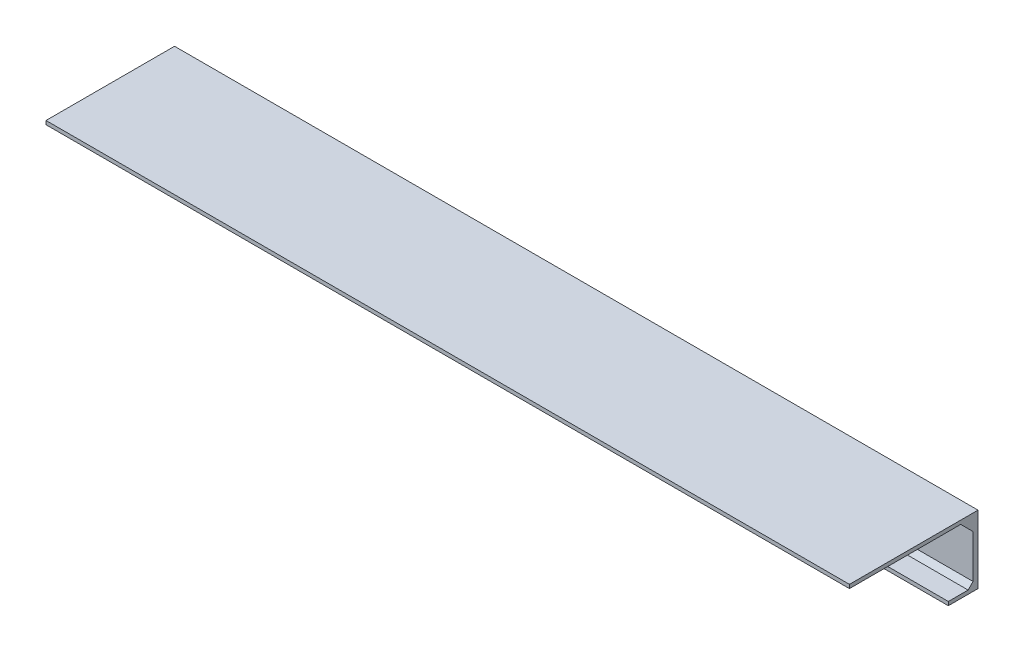
ISO-10303-21;
HEADER;
FILE_DESCRIPTION(('STEP AP214'),'2;1');
FILE_NAME('part.step','',(''),(''),'','','');
FILE_SCHEMA(('AUTOMOTIVE_DESIGN { 1 0 10303 214 1 1 1 1 }'));
ENDSEC;
DATA;
#1=APPLICATION_CONTEXT('core data for automotive mechanical design processes');
#2=APPLICATION_PROTOCOL_DEFINITION('international standard','automotive_design',2000,#1);
#3=PRODUCT_CONTEXT('',#1,'mechanical');
#4=PRODUCT('Part','Part','',(#3));
#5=PRODUCT_RELATED_PRODUCT_CATEGORY('part','',(#4));
#6=PRODUCT_DEFINITION_FORMATION('','',#4);
#7=PRODUCT_DEFINITION_CONTEXT('part definition',#1,'design');
#8=PRODUCT_DEFINITION('design','',#6,#7);
#9=PRODUCT_DEFINITION_SHAPE('','',#8);
#10=(LENGTH_UNIT() NAMED_UNIT(*) SI_UNIT(.MILLI.,.METRE.));
#11=(NAMED_UNIT(*) PLANE_ANGLE_UNIT() SI_UNIT($,.RADIAN.));
#12=(NAMED_UNIT(*) SI_UNIT($,.STERADIAN.) SOLID_ANGLE_UNIT());
#13=UNCERTAINTY_MEASURE_WITH_UNIT(LENGTH_MEASURE(1.E-05),#10,'distance_accuracy_value','');
#14=(GEOMETRIC_REPRESENTATION_CONTEXT(3) GLOBAL_UNCERTAINTY_ASSIGNED_CONTEXT((#13)) GLOBAL_UNIT_ASSIGNED_CONTEXT((#10,
#11,#12)) REPRESENTATION_CONTEXT('',''));
#15=CARTESIAN_POINT('',(0.,0.,0.));
#16=DIRECTION('',(0.,0.,1.));
#17=DIRECTION('',(1.,0.,0.));
#18=AXIS2_PLACEMENT_3D('',#15,#16,#17);
#19=CARTESIAN_POINT('',(0.,0.,0.8));
#20=DIRECTION('',(0.,0.,1.));
#21=DIRECTION('',(1.,0.,0.));
#22=AXIS2_PLACEMENT_3D('',#19,#20,#21);
#23=PLANE('',#22);
#24=DIRECTION('',(0.,-1.,0.));
#25=VECTOR('',#24,1.);
#26=CARTESIAN_POINT('',(-65.,-5.50000000000001,0.8));
#27=LINE('',#26,#25);
#28=CARTESIAN_POINT('',(-65.,2.89999999999999,0.8));
#29=VERTEX_POINT('',#28);
#30=CARTESIAN_POINT('',(-65.,-4.1,0.8));
#31=VERTEX_POINT('',#30);
#32=EDGE_CURVE('E174',#29,#31,#27,.T.);
#33=ORIENTED_EDGE('',*,*,#32,.T.);
#34=DIRECTION('',(-1.,0.,0.));
#35=VECTOR('',#34,1.);
#36=CARTESIAN_POINT('',(-65.,-4.1,0.8));
#37=LINE('',#36,#35);
#38=CARTESIAN_POINT('',(65.,-4.1,0.8));
#39=VERTEX_POINT('',#38);
#40=EDGE_CURVE('E65',#39,#31,#37,.T.);
#41=ORIENTED_EDGE('',*,*,#40,.F.);
#42=DIRECTION('',(0.,1.,0.));
#43=VECTOR('',#42,1.);
#44=CARTESIAN_POINT('',(65.,-5.49999999999999,0.8));
#45=LINE('',#44,#43);
#46=CARTESIAN_POINT('',(65.,2.89999999999999,0.8));
#47=VERTEX_POINT('',#46);
#48=EDGE_CURVE('E126',#39,#47,#45,.T.);
#49=ORIENTED_EDGE('',*,*,#48,.T.);
#50=DIRECTION('',(1.,0.,0.));
#51=VECTOR('',#50,1.);
#52=CARTESIAN_POINT('',(-65.,2.89999999999999,0.8));
#53=LINE('',#52,#51);
#54=EDGE_CURVE('E135',#29,#47,#53,.T.);
#55=ORIENTED_EDGE('',*,*,#54,.F.);
#56=EDGE_LOOP('',(#33,#41,#49,#55));
#57=FACE_BOUND('',#56,.T.);
#58=ADVANCED_FACE('F43',(#57),#23,.T.);
#59=CARTESIAN_POINT('',(-65.,-4.90000000000001,4.8));
#60=DIRECTION('',(0.,-1.,0.));
#61=DIRECTION('',(0.,0.,-1.));
#62=AXIS2_PLACEMENT_3D('',#59,#60,#61);
#63=PLANE('',#62);
#64=DIRECTION('',(1.,0.,0.));
#65=VECTOR('',#64,1.);
#66=CARTESIAN_POINT('',(-65.,-4.90000000000001,1.6));
#67=LINE('',#66,#65);
#68=CARTESIAN_POINT('',(-65.,-4.90000000000001,1.6));
#69=VERTEX_POINT('',#68);
#70=CARTESIAN_POINT('',(65.,-4.90000000000001,1.6));
#71=VERTEX_POINT('',#70);
#72=EDGE_CURVE('E133',#69,#71,#67,.T.);
#73=ORIENTED_EDGE('',*,*,#72,.F.);
#74=DIRECTION('',(0.,0.,-1.));
#75=VECTOR('',#74,1.);
#76=CARTESIAN_POINT('',(-65.,-4.90000000000001,4.8));
#77=LINE('',#76,#75);
#78=CARTESIAN_POINT('',(-65.,-4.90000000000001,4.8));
#79=VERTEX_POINT('',#78);
#80=EDGE_CURVE('E136',#79,#69,#77,.T.);
#81=ORIENTED_EDGE('',*,*,#80,.F.);
#82=DIRECTION('',(-1.,0.,0.));
#83=VECTOR('',#82,1.);
#84=CARTESIAN_POINT('',(-65.,-4.90000000000001,4.8));
#85=LINE('',#84,#83);
#86=CARTESIAN_POINT('',(65.,-4.90000000000001,4.8));
#87=VERTEX_POINT('',#86);
#88=EDGE_CURVE('E134',#87,#79,#85,.T.);
#89=ORIENTED_EDGE('',*,*,#88,.F.);
#90=DIRECTION('',(0.,0.,-1.));
#91=VECTOR('',#90,1.);
#92=CARTESIAN_POINT('',(65.,-4.90000000000001,4.8));
#93=LINE('',#92,#91);
#94=EDGE_CURVE('E123',#87,#71,#93,.T.);
#95=ORIENTED_EDGE('',*,*,#94,.T.);
#96=EDGE_LOOP('',(#73,#81,#89,#95));
#97=FACE_BOUND('',#96,.T.);
#98=ADVANCED_FACE('F131',(#97),#63,.F.);
#99=CARTESIAN_POINT('',(-65.,-5.50000000000001,0.8));
#100=DIRECTION('',(1.,0.,0.));
#101=DIRECTION('',(0.,0.,-1.));
#102=AXIS2_PLACEMENT_3D('',#99,#100,#101);
#103=PLANE('',#102);
#104=ORIENTED_EDGE('',*,*,#80,.T.);
#105=DIRECTION('',(0.,-0.707106781186548,0.707106781186548));
#106=VECTOR('',#105,1.);
#107=CARTESIAN_POINT('',(-65.,-4.9,1.6));
#108=LINE('',#107,#106);
#109=EDGE_CURVE('E52',#69,#31,#108,.F.);
#110=ORIENTED_EDGE('',*,*,#109,.T.);
#111=ORIENTED_EDGE('',*,*,#32,.F.);
#112=DIRECTION('',(0.,0.707106781186548,0.707106781186547));
#113=VECTOR('',#112,1.);
#114=CARTESIAN_POINT('',(-65.,4.89999999999998,2.8));
#115=LINE('',#114,#113);
#116=CARTESIAN_POINT('',(-65.,4.9,2.8));
#117=VERTEX_POINT('',#116);
#118=EDGE_CURVE('E199',#29,#117,#115,.T.);
#119=ORIENTED_EDGE('',*,*,#118,.T.);
#120=DIRECTION('',(0.,0.,-1.));
#121=VECTOR('',#120,1.);
#122=CARTESIAN_POINT('',(-65.,4.9,20.8));
#123=LINE('',#122,#121);
#124=CARTESIAN_POINT('',(-65.,4.9,20.8));
#125=VERTEX_POINT('',#124);
#126=EDGE_CURVE('E170',#125,#117,#123,.T.);
#127=ORIENTED_EDGE('',*,*,#126,.F.);
#128=DIRECTION('',(0.,-1.,0.));
#129=VECTOR('',#128,1.);
#130=CARTESIAN_POINT('',(-65.,5.49999999999999,20.8));
#131=LINE('',#130,#129);
#132=CARTESIAN_POINT('',(-65.,5.49999999999999,20.8));
#133=VERTEX_POINT('',#132);
#134=EDGE_CURVE('E154',#133,#125,#131,.T.);
#135=ORIENTED_EDGE('',*,*,#134,.F.);
#136=DIRECTION('',(0.,0.,-1.));
#137=VECTOR('',#136,1.);
#138=CARTESIAN_POINT('',(-65.,5.49999999999999,0.8));
#139=LINE('',#138,#137);
#140=CARTESIAN_POINT('',(-65.,5.49999999999999,0.));
#141=VERTEX_POINT('',#140);
#142=EDGE_CURVE('E178',#133,#141,#139,.T.);
#143=ORIENTED_EDGE('',*,*,#142,.T.);
#144=DIRECTION('',(0.,-1.,0.));
#145=VECTOR('',#144,1.);
#146=CARTESIAN_POINT('',(-65.,-5.50000000000001,0.));
#147=LINE('',#146,#145);
#148=CARTESIAN_POINT('',(-65.,-5.50000000000001,0.));
#149=VERTEX_POINT('',#148);
#150=EDGE_CURVE('E173',#141,#149,#147,.T.);
#151=ORIENTED_EDGE('',*,*,#150,.T.);
#152=DIRECTION('',(0.,0.,-1.));
#153=VECTOR('',#152,1.);
#154=CARTESIAN_POINT('',(-65.,-5.50000000000001,0.8));
#155=LINE('',#154,#153);
#156=CARTESIAN_POINT('',(-65.,-5.50000000000001,4.8));
#157=VERTEX_POINT('',#156);
#158=EDGE_CURVE('E194',#157,#149,#155,.T.);
#159=ORIENTED_EDGE('',*,*,#158,.F.);
#160=DIRECTION('',(0.,-1.,0.));
#161=VECTOR('',#160,1.);
#162=CARTESIAN_POINT('',(-65.,-5.50000000000001,4.8));
#163=LINE('',#162,#161);
#164=EDGE_CURVE('E138',#79,#157,#163,.T.);
#165=ORIENTED_EDGE('',*,*,#164,.F.);
#166=EDGE_LOOP('',(#104,#110,#111,#119,#127,#135,#143,#151,#159,#165));
#167=FACE_BOUND('',#166,.T.);
#168=ADVANCED_FACE('F202',(#167),#103,.F.);
#169=CARTESIAN_POINT('',(65.,-5.49999999999999,0.8));
#170=DIRECTION('',(0.,1.,0.));
#171=DIRECTION('',(-1.,0.,0.));
#172=AXIS2_PLACEMENT_3D('',#169,#170,#171);
#173=PLANE('',#172);
#174=DIRECTION('',(1.,0.,0.));
#175=VECTOR('',#174,1.);
#176=CARTESIAN_POINT('',(65.,-5.49999999999999,0.));
#177=LINE('',#176,#175);
#178=CARTESIAN_POINT('',(65.,-5.49999999999999,0.));
#179=VERTEX_POINT('',#178);
#180=EDGE_CURVE('E181',#149,#179,#177,.T.);
#181=ORIENTED_EDGE('',*,*,#180,.T.);
#182=DIRECTION('',(0.,0.,-1.));
#183=VECTOR('',#182,1.);
#184=CARTESIAN_POINT('',(65.,-5.49999999999999,0.8));
#185=LINE('',#184,#183);
#186=CARTESIAN_POINT('',(65.,-5.50000000000001,4.8));
#187=VERTEX_POINT('',#186);
#188=EDGE_CURVE('E191',#187,#179,#185,.T.);
#189=ORIENTED_EDGE('',*,*,#188,.F.);
#190=DIRECTION('',(1.,0.,0.));
#191=VECTOR('',#190,1.);
#192=CARTESIAN_POINT('',(-65.,-5.50000000000001,4.8));
#193=LINE('',#192,#191);
#194=EDGE_CURVE('E141',#157,#187,#193,.T.);
#195=ORIENTED_EDGE('',*,*,#194,.F.);
#196=ORIENTED_EDGE('',*,*,#158,.T.);
#197=EDGE_LOOP('',(#181,#189,#195,#196));
#198=FACE_BOUND('',#197,.T.);
#199=ADVANCED_FACE('F223',(#198),#173,.F.);
#200=CARTESIAN_POINT('',(65.,-5.49999999999999,0.8));
#201=DIRECTION('',(-1.,0.,0.));
#202=DIRECTION('',(0.,0.,1.));
#203=AXIS2_PLACEMENT_3D('',#200,#201,#202);
#204=PLANE('',#203);
#205=ORIENTED_EDGE('',*,*,#48,.F.);
#206=DIRECTION('',(0.,0.707106781186548,-0.707106781186548));
#207=VECTOR('',#206,1.);
#208=CARTESIAN_POINT('',(65.,-4.9,1.6));
#209=LINE('',#208,#207);
#210=EDGE_CURVE('E11',#39,#71,#209,.F.);
#211=ORIENTED_EDGE('',*,*,#210,.T.);
#212=ORIENTED_EDGE('',*,*,#94,.F.);
#213=DIRECTION('',(0.,1.,0.));
#214=VECTOR('',#213,1.);
#215=CARTESIAN_POINT('',(65.,-5.50000000000001,4.8));
#216=LINE('',#215,#214);
#217=EDGE_CURVE('E147',#187,#87,#216,.T.);
#218=ORIENTED_EDGE('',*,*,#217,.F.);
#219=ORIENTED_EDGE('',*,*,#188,.T.);
#220=DIRECTION('',(0.,1.,0.));
#221=VECTOR('',#220,1.);
#222=CARTESIAN_POINT('',(65.,-5.49999999999999,0.));
#223=LINE('',#222,#221);
#224=CARTESIAN_POINT('',(65.,5.50000000000001,0.));
#225=VERTEX_POINT('',#224);
#226=EDGE_CURVE('E183',#179,#225,#223,.T.);
#227=ORIENTED_EDGE('',*,*,#226,.T.);
#228=DIRECTION('',(0.,0.,-1.));
#229=VECTOR('',#228,1.);
#230=CARTESIAN_POINT('',(65.,5.50000000000001,0.8));
#231=LINE('',#230,#229);
#232=CARTESIAN_POINT('',(65.,5.49999999999999,20.8));
#233=VERTEX_POINT('',#232);
#234=EDGE_CURVE('E188',#233,#225,#231,.T.);
#235=ORIENTED_EDGE('',*,*,#234,.F.);
#236=DIRECTION('',(0.,1.,0.));
#237=VECTOR('',#236,1.);
#238=CARTESIAN_POINT('',(65.,5.49999999999999,20.8));
#239=LINE('',#238,#237);
#240=CARTESIAN_POINT('',(65.,4.9,20.8));
#241=VERTEX_POINT('',#240);
#242=EDGE_CURVE('E161',#241,#233,#239,.T.);
#243=ORIENTED_EDGE('',*,*,#242,.F.);
#244=DIRECTION('',(0.,0.,-1.));
#245=VECTOR('',#244,1.);
#246=CARTESIAN_POINT('',(65.,4.9,20.8));
#247=LINE('',#246,#245);
#248=CARTESIAN_POINT('',(65.,4.9,2.8));
#249=VERTEX_POINT('',#248);
#250=EDGE_CURVE('E167',#241,#249,#247,.T.);
#251=ORIENTED_EDGE('',*,*,#250,.T.);
#252=DIRECTION('',(0.,-0.707106781186548,-0.707106781186547));
#253=VECTOR('',#252,1.);
#254=CARTESIAN_POINT('',(65.,4.89999999999998,2.8));
#255=LINE('',#254,#253);
#256=EDGE_CURVE('E197',#249,#47,#255,.T.);
#257=ORIENTED_EDGE('',*,*,#256,.T.);
#258=EDGE_LOOP('',(#205,#211,#212,#218,#219,#227,#235,#243,#251,#257));
#259=FACE_BOUND('',#258,.T.);
#260=ADVANCED_FACE('F121',(#259),#204,.F.);
#261=CARTESIAN_POINT('',(65.,5.50000000000001,0.8));
#262=DIRECTION('',(0.,-1.,0.));
#263=DIRECTION('',(1.,0.,0.));
#264=AXIS2_PLACEMENT_3D('',#261,#262,#263);
#265=PLANE('',#264);
#266=DIRECTION('',(-1.,0.,0.));
#267=VECTOR('',#266,1.);
#268=CARTESIAN_POINT('',(65.,5.50000000000001,0.));
#269=LINE('',#268,#267);
#270=EDGE_CURVE('E176',#225,#141,#269,.T.);
#271=ORIENTED_EDGE('',*,*,#270,.T.);
#272=ORIENTED_EDGE('',*,*,#142,.F.);
#273=DIRECTION('',(-1.,0.,0.));
#274=VECTOR('',#273,1.);
#275=CARTESIAN_POINT('',(-65.,5.49999999999999,20.8));
#276=LINE('',#275,#274);
#277=EDGE_CURVE('E164',#233,#133,#276,.T.);
#278=ORIENTED_EDGE('',*,*,#277,.F.);
#279=ORIENTED_EDGE('',*,*,#234,.T.);
#280=EDGE_LOOP('',(#271,#272,#278,#279));
#281=FACE_BOUND('',#280,.T.);
#282=ADVANCED_FACE('F215',(#281),#265,.F.);
#283=CARTESIAN_POINT('',(0.,0.,0.));
#284=DIRECTION('',(0.,0.,1.));
#285=DIRECTION('',(1.,0.,0.));
#286=AXIS2_PLACEMENT_3D('',#283,#284,#285);
#287=PLANE('',#286);
#288=ORIENTED_EDGE('',*,*,#150,.F.);
#289=ORIENTED_EDGE('',*,*,#270,.F.);
#290=ORIENTED_EDGE('',*,*,#226,.F.);
#291=ORIENTED_EDGE('',*,*,#180,.F.);
#292=EDGE_LOOP('',(#288,#289,#290,#291));
#293=FACE_BOUND('',#292,.T.);
#294=ADVANCED_FACE('F219',(#293),#287,.F.);
#295=CARTESIAN_POINT('',(-65.,4.9,20.8));
#296=DIRECTION('',(0.,1.,0.));
#297=DIRECTION('',(-1.,0.,0.));
#298=AXIS2_PLACEMENT_3D('',#295,#296,#297);
#299=PLANE('',#298);
#300=ORIENTED_EDGE('',*,*,#126,.T.);
#301=DIRECTION('',(-1.,0.,0.));
#302=VECTOR('',#301,1.);
#303=CARTESIAN_POINT('',(-65.,4.9,2.8));
#304=LINE('',#303,#302);
#305=EDGE_CURVE('E151',#249,#117,#304,.T.);
#306=ORIENTED_EDGE('',*,*,#305,.F.);
#307=ORIENTED_EDGE('',*,*,#250,.F.);
#308=DIRECTION('',(1.,0.,0.));
#309=VECTOR('',#308,1.);
#310=CARTESIAN_POINT('',(-65.,4.9,20.8));
#311=LINE('',#310,#309);
#312=EDGE_CURVE('E159',#125,#241,#311,.T.);
#313=ORIENTED_EDGE('',*,*,#312,.F.);
#314=EDGE_LOOP('',(#300,#306,#307,#313));
#315=FACE_BOUND('',#314,.T.);
#316=ADVANCED_FACE('F207',(#315),#299,.F.);
#317=CARTESIAN_POINT('',(0.,0.,20.8));
#318=DIRECTION('',(0.,0.,1.));
#319=DIRECTION('',(1.,0.,0.));
#320=AXIS2_PLACEMENT_3D('',#317,#318,#319);
#321=PLANE('',#320);
#322=ORIENTED_EDGE('',*,*,#134,.T.);
#323=ORIENTED_EDGE('',*,*,#312,.T.);
#324=ORIENTED_EDGE('',*,*,#242,.T.);
#325=ORIENTED_EDGE('',*,*,#277,.T.);
#326=EDGE_LOOP('',(#322,#323,#324,#325));
#327=FACE_BOUND('',#326,.T.);
#328=ADVANCED_FACE('F213',(#327),#321,.T.);
#329=CARTESIAN_POINT('',(0.,4.89999999999998,2.8));
#330=DIRECTION('',(0.,-0.707106781186547,0.707106781186548));
#331=DIRECTION('',(-1.,0.,0.));
#332=AXIS2_PLACEMENT_3D('',#329,#330,#331);
#333=PLANE('',#332);
#334=ORIENTED_EDGE('',*,*,#118,.F.);
#335=ORIENTED_EDGE('',*,*,#54,.T.);
#336=ORIENTED_EDGE('',*,*,#256,.F.);
#337=ORIENTED_EDGE('',*,*,#305,.T.);
#338=EDGE_LOOP('',(#334,#335,#336,#337));
#339=FACE_BOUND('',#338,.T.);
#340=ADVANCED_FACE('F209',(#339),#333,.T.);
#341=CARTESIAN_POINT('',(0.,0.,4.8));
#342=DIRECTION('',(0.,0.,-1.));
#343=DIRECTION('',(-1.,0.,0.));
#344=AXIS2_PLACEMENT_3D('',#341,#342,#343);
#345=PLANE('',#344);
#346=ORIENTED_EDGE('',*,*,#164,.T.);
#347=ORIENTED_EDGE('',*,*,#194,.T.);
#348=ORIENTED_EDGE('',*,*,#217,.T.);
#349=ORIENTED_EDGE('',*,*,#88,.T.);
#350=EDGE_LOOP('',(#346,#347,#348,#349));
#351=FACE_BOUND('',#350,.T.);
#352=ADVANCED_FACE('F226',(#351),#345,.F.);
#353=CARTESIAN_POINT('',(0.,-4.9,1.6));
#354=DIRECTION('',(0.,-0.707106781186548,-0.707106781186548));
#355=DIRECTION('',(-1.,0.,0.));
#356=AXIS2_PLACEMENT_3D('',#353,#354,#355);
#357=PLANE('',#356);
#358=ORIENTED_EDGE('',*,*,#210,.F.);
#359=ORIENTED_EDGE('',*,*,#40,.T.);
#360=ORIENTED_EDGE('',*,*,#109,.F.);
#361=ORIENTED_EDGE('',*,*,#72,.T.);
#362=EDGE_LOOP('',(#358,#359,#360,#361));
#363=FACE_BOUND('',#362,.T.);
#364=ADVANCED_FACE('F46',(#363),#357,.F.);
#365=CLOSED_SHELL('',(#58,#98,#168,#199,#260,#282,#294,#316,#328,#340,#352,#364));
#366=MANIFOLD_SOLID_BREP('B2',#365);
#367=ADVANCED_BREP_SHAPE_REPRESENTATION('',(#18,#366),#14);
#368=SHAPE_DEFINITION_REPRESENTATION(#9,#367);
ENDSEC;
END-ISO-10303-21;
